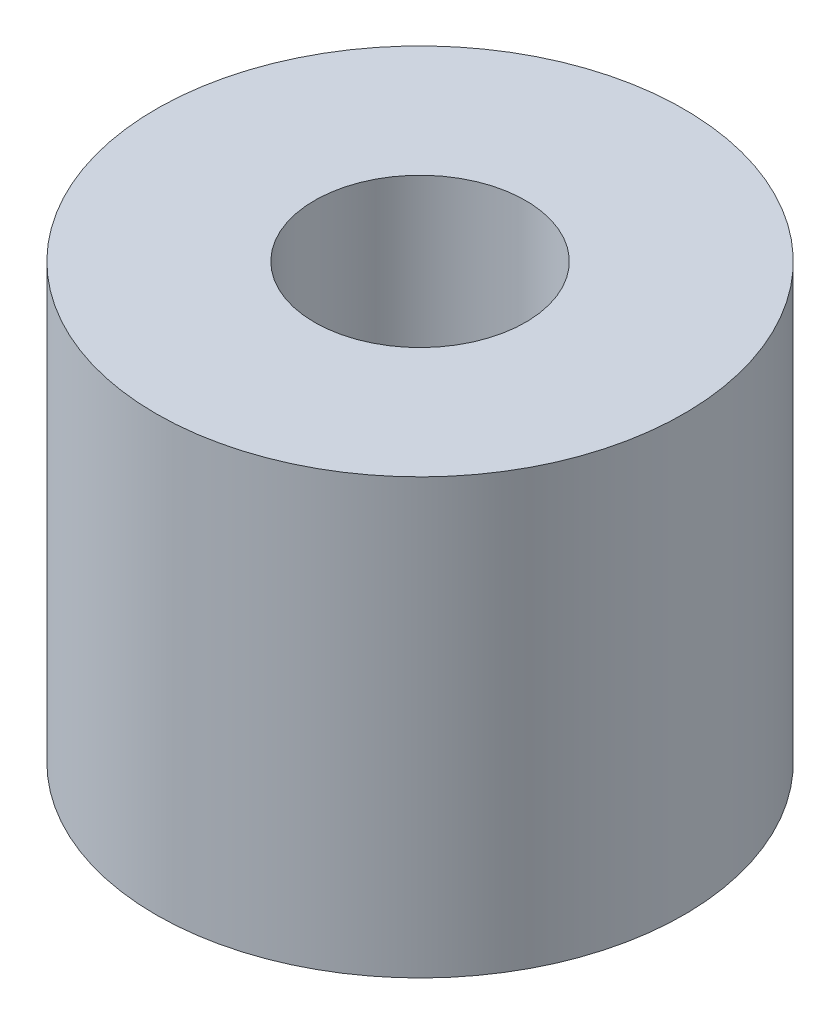
ISO-10303-21;
HEADER;
FILE_DESCRIPTION(('STEP AP214'),'2;1');
FILE_NAME('part.step','',(''),(''),'','','');
FILE_SCHEMA(('AUTOMOTIVE_DESIGN { 1 0 10303 214 1 1 1 1 }'));
ENDSEC;
DATA;
#1=APPLICATION_CONTEXT('core data for automotive mechanical design processes');
#2=APPLICATION_PROTOCOL_DEFINITION('international standard','automotive_design',2000,#1);
#3=PRODUCT_CONTEXT('',#1,'mechanical');
#4=PRODUCT('Part','Part','',(#3));
#5=PRODUCT_RELATED_PRODUCT_CATEGORY('part','',(#4));
#6=PRODUCT_DEFINITION_FORMATION('','',#4);
#7=PRODUCT_DEFINITION_CONTEXT('part definition',#1,'design');
#8=PRODUCT_DEFINITION('design','',#6,#7);
#9=PRODUCT_DEFINITION_SHAPE('','',#8);
#10=(LENGTH_UNIT() NAMED_UNIT(*) SI_UNIT(.MILLI.,.METRE.));
#11=(NAMED_UNIT(*) PLANE_ANGLE_UNIT() SI_UNIT($,.RADIAN.));
#12=(NAMED_UNIT(*) SI_UNIT($,.STERADIAN.) SOLID_ANGLE_UNIT());
#13=UNCERTAINTY_MEASURE_WITH_UNIT(LENGTH_MEASURE(1.E-05),#10,'distance_accuracy_value','');
#14=(GEOMETRIC_REPRESENTATION_CONTEXT(3) GLOBAL_UNCERTAINTY_ASSIGNED_CONTEXT((#13)) GLOBAL_UNIT_ASSIGNED_CONTEXT((#10,
#11,#12)) REPRESENTATION_CONTEXT('',''));
#15=CARTESIAN_POINT('',(0.,0.,0.));
#16=DIRECTION('',(0.,0.,1.));
#17=DIRECTION('',(1.,0.,0.));
#18=AXIS2_PLACEMENT_3D('',#15,#16,#17);
#19=CARTESIAN_POINT('',(0.,3.7,0.));
#20=DIRECTION('',(0.,1.,0.));
#21=DIRECTION('',(0.,0.,1.));
#22=AXIS2_PLACEMENT_3D('',#19,#20,#21);
#23=PLANE('',#22);
#24=CARTESIAN_POINT('',(0.,3.7,0.));
#25=DIRECTION('',(0.,1.,0.));
#26=DIRECTION('',(0.,0.,1.));
#27=AXIS2_PLACEMENT_3D('',#24,#25,#26);
#28=CIRCLE('',#27,2.25);
#29=CARTESIAN_POINT('',(0.,3.7,2.25));
#30=VERTEX_POINT('',#29);
#31=EDGE_CURVE('E10',#30,#30,#28,.T.);
#32=ORIENTED_EDGE('',*,*,#31,.T.);
#33=EDGE_LOOP('',(#32));
#34=FACE_BOUND('',#33,.T.);
#35=CARTESIAN_POINT('',(0.,3.7,0.));
#36=DIRECTION('',(0.,1.,0.));
#37=DIRECTION('',(0.,0.,1.));
#38=AXIS2_PLACEMENT_3D('',#35,#36,#37);
#39=CIRCLE('',#38,0.9);
#40=CARTESIAN_POINT('',(0.,3.7,0.9));
#41=VERTEX_POINT('',#40);
#42=EDGE_CURVE('E46',#41,#41,#39,.T.);
#43=ORIENTED_EDGE('',*,*,#42,.F.);
#44=EDGE_LOOP('',(#43));
#45=FACE_BOUND('',#44,.T.);
#46=ADVANCED_FACE('F35',(#34,#45),#23,.T.);
#47=CARTESIAN_POINT('',(0.,0.,0.));
#48=DIRECTION('',(0.,1.,0.));
#49=DIRECTION('',(0.,0.,1.));
#50=AXIS2_PLACEMENT_3D('',#47,#48,#49);
#51=PLANE('',#50);
#52=CARTESIAN_POINT('',(0.,0.,0.));
#53=DIRECTION('',(0.,1.,0.));
#54=DIRECTION('',(0.,0.,1.));
#55=AXIS2_PLACEMENT_3D('',#52,#53,#54);
#56=CIRCLE('',#55,2.25);
#57=CARTESIAN_POINT('',(0.,0.,2.25));
#58=VERTEX_POINT('',#57);
#59=EDGE_CURVE('E39',#58,#58,#56,.T.);
#60=ORIENTED_EDGE('',*,*,#59,.F.);
#61=EDGE_LOOP('',(#60));
#62=FACE_BOUND('',#61,.T.);
#63=CARTESIAN_POINT('',(0.,0.,0.));
#64=DIRECTION('',(0.,1.,0.));
#65=DIRECTION('',(0.,0.,1.));
#66=AXIS2_PLACEMENT_3D('',#63,#64,#65);
#67=CIRCLE('',#66,0.9);
#68=CARTESIAN_POINT('',(0.,0.,0.9));
#69=VERTEX_POINT('',#68);
#70=EDGE_CURVE('E48',#69,#69,#67,.T.);
#71=ORIENTED_EDGE('',*,*,#70,.T.);
#72=EDGE_LOOP('',(#71));
#73=FACE_BOUND('',#72,.T.);
#74=ADVANCED_FACE('F58',(#62,#73),#51,.F.);
#75=CARTESIAN_POINT('',(0.,3.7,0.));
#76=DIRECTION('',(0.,-1.,0.));
#77=DIRECTION('',(0.,0.,-1.));
#78=AXIS2_PLACEMENT_3D('',#75,#76,#77);
#79=CYLINDRICAL_SURFACE('',#78,2.25);
#80=ORIENTED_EDGE('',*,*,#31,.F.);
#81=EDGE_LOOP('',(#80));
#82=FACE_BOUND('',#81,.T.);
#83=ORIENTED_EDGE('',*,*,#59,.T.);
#84=EDGE_LOOP('',(#83));
#85=FACE_BOUND('',#84,.T.);
#86=ADVANCED_FACE('F37',(#82,#85),#79,.T.);
#87=CARTESIAN_POINT('',(0.,3.7,0.));
#88=DIRECTION('',(0.,-1.,0.));
#89=DIRECTION('',(0.,0.,-1.));
#90=AXIS2_PLACEMENT_3D('',#87,#88,#89);
#91=CYLINDRICAL_SURFACE('',#90,0.9);
#92=ORIENTED_EDGE('',*,*,#42,.T.);
#93=EDGE_LOOP('',(#92));
#94=FACE_BOUND('',#93,.T.);
#95=ORIENTED_EDGE('',*,*,#70,.F.);
#96=EDGE_LOOP('',(#95));
#97=FACE_BOUND('',#96,.T.);
#98=ADVANCED_FACE('F54',(#94,#97),#91,.F.);
#99=CLOSED_SHELL('',(#46,#74,#86,#98));
#100=MANIFOLD_SOLID_BREP('B2',#99);
#101=ADVANCED_BREP_SHAPE_REPRESENTATION('',(#18,#100),#14);
#102=SHAPE_DEFINITION_REPRESENTATION(#9,#101);
ENDSEC;
END-ISO-10303-21;
